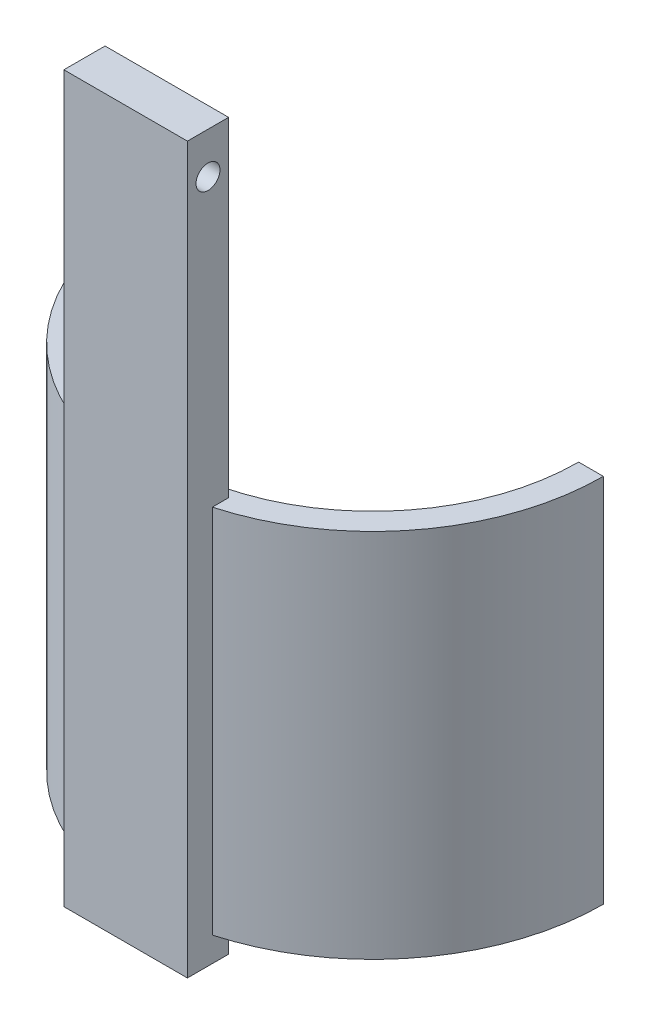
ISO-10303-21;
HEADER;
FILE_DESCRIPTION(('STEP AP214'),'2;1');
FILE_NAME('part.step','',(''),(''),'','','');
FILE_SCHEMA(('AUTOMOTIVE_DESIGN { 1 0 10303 214 1 1 1 1 }'));
ENDSEC;
DATA;
#1=APPLICATION_CONTEXT('core data for automotive mechanical design processes');
#2=APPLICATION_PROTOCOL_DEFINITION('international standard','automotive_design',2000,#1);
#3=PRODUCT_CONTEXT('',#1,'mechanical');
#4=PRODUCT('Part','Part','',(#3));
#5=PRODUCT_RELATED_PRODUCT_CATEGORY('part','',(#4));
#6=PRODUCT_DEFINITION_FORMATION('','',#4);
#7=PRODUCT_DEFINITION_CONTEXT('part definition',#1,'design');
#8=PRODUCT_DEFINITION('design','',#6,#7);
#9=PRODUCT_DEFINITION_SHAPE('','',#8);
#10=(LENGTH_UNIT() NAMED_UNIT(*) SI_UNIT(.MILLI.,.METRE.));
#11=(NAMED_UNIT(*) PLANE_ANGLE_UNIT() SI_UNIT($,.RADIAN.));
#12=(NAMED_UNIT(*) SI_UNIT($,.STERADIAN.) SOLID_ANGLE_UNIT());
#13=UNCERTAINTY_MEASURE_WITH_UNIT(LENGTH_MEASURE(1.E-05),#10,'distance_accuracy_value','');
#14=(GEOMETRIC_REPRESENTATION_CONTEXT(3) GLOBAL_UNCERTAINTY_ASSIGNED_CONTEXT((#13)) GLOBAL_UNIT_ASSIGNED_CONTEXT((#10,
#11,#12)) REPRESENTATION_CONTEXT('',''));
#15=CARTESIAN_POINT('',(0.,0.,0.));
#16=DIRECTION('',(0.,0.,1.));
#17=DIRECTION('',(1.,0.,0.));
#18=AXIS2_PLACEMENT_3D('',#15,#16,#17);
#19=CARTESIAN_POINT('',(50.4457593688363,45.,-1.74574066942157E-13));
#20=DIRECTION('',(0.,-1.,0.));
#21=DIRECTION('',(0.,0.,-1.));
#22=AXIS2_PLACEMENT_3D('',#19,#20,#21);
#23=PLANE('',#22);
#24=DIRECTION('',(0.,0.,-1.));
#25=VECTOR('',#24,1.);
#26=CARTESIAN_POINT('',(32.9457593688363,45.,-1.74574066942157E-13));
#27=LINE('',#26,#25);
#28=CARTESIAN_POINT('',(32.9457593688363,45.,26.9768419204324));
#29=VERTEX_POINT('',#28);
#30=CARTESIAN_POINT('',(32.9457593688363,45.,25.));
#31=VERTEX_POINT('',#30);
#32=EDGE_CURVE('E150',#29,#31,#27,.T.);
#33=ORIENTED_EDGE('',*,*,#32,.F.);
#34=CARTESIAN_POINT('',(25.4457593688363,45.,0.));
#35=DIRECTION('',(0.,-1.,0.));
#36=DIRECTION('',(0.,0.,-1.));
#37=AXIS2_PLACEMENT_3D('',#34,#35,#36);
#38=CIRCLE('',#37,28.);
#39=CARTESIAN_POINT('',(53.4457593688363,45.,-1.95522954975215E-13));
#40=VERTEX_POINT('',#39);
#41=EDGE_CURVE('E234',#40,#29,#38,.T.);
#42=ORIENTED_EDGE('',*,*,#41,.F.);
#43=DIRECTION('',(1.,0.,0.));
#44=VECTOR('',#43,1.);
#45=CARTESIAN_POINT('',(50.4457593688363,45.,-1.74574066942157E-13));
#46=LINE('',#45,#44);
#47=CARTESIAN_POINT('',(50.4457593688363,45.,-1.74574066942157E-13));
#48=VERTEX_POINT('',#47);
#49=EDGE_CURVE('E259',#48,#40,#46,.T.);
#50=ORIENTED_EDGE('',*,*,#49,.F.);
#51=CARTESIAN_POINT('',(25.4457593688363,45.,0.));
#52=DIRECTION('',(0.,-1.,0.));
#53=DIRECTION('',(0.,0.,-1.));
#54=AXIS2_PLACEMENT_3D('',#51,#52,#53);
#55=CIRCLE('',#54,25.);
#56=CARTESIAN_POINT('',(25.4457593688363,45.,25.));
#57=VERTEX_POINT('',#56);
#58=EDGE_CURVE('E230',#48,#57,#55,.T.);
#59=ORIENTED_EDGE('',*,*,#58,.T.);
#60=DIRECTION('',(1.,0.,0.));
#61=VECTOR('',#60,1.);
#62=CARTESIAN_POINT('',(50.4457593688363,45.,25.));
#63=LINE('',#62,#61);
#64=EDGE_CURVE('E200',#57,#31,#63,.T.);
#65=ORIENTED_EDGE('',*,*,#64,.T.);
#66=EDGE_LOOP('',(#33,#42,#50,#59,#65));
#67=FACE_BOUND('',#66,.T.);
#68=ADVANCED_FACE('F37',(#67),#23,.F.);
#69=CARTESIAN_POINT('',(25.4457593688363,0.,0.));
#70=DIRECTION('',(0.,-1.,0.));
#71=DIRECTION('',(0.,0.,-1.));
#72=AXIS2_PLACEMENT_3D('',#69,#70,#71);
#73=CYLINDRICAL_SURFACE('',#72,28.);
#74=DIRECTION('',(0.,-1.,0.));
#75=VECTOR('',#74,1.);
#76=CARTESIAN_POINT('',(32.9457593688363,0.,26.9768419204324));
#77=LINE('',#76,#75);
#78=CARTESIAN_POINT('',(32.9457593688363,0.,26.9768419204324));
#79=VERTEX_POINT('',#78);
#80=EDGE_CURVE('E283',#79,#29,#77,.F.);
#81=ORIENTED_EDGE('',*,*,#80,.F.);
#82=CARTESIAN_POINT('',(25.4457593688363,0.,0.));
#83=DIRECTION('',(0.,-1.,0.));
#84=DIRECTION('',(0.,0.,-1.));
#85=AXIS2_PLACEMENT_3D('',#82,#83,#84);
#86=CIRCLE('',#85,28.);
#87=CARTESIAN_POINT('',(53.4457593688363,0.,-1.95522954975215E-13));
#88=VERTEX_POINT('',#87);
#89=EDGE_CURVE('E238',#88,#79,#86,.T.);
#90=ORIENTED_EDGE('',*,*,#89,.F.);
#91=DIRECTION('',(0.,-1.,0.));
#92=VECTOR('',#91,1.);
#93=CARTESIAN_POINT('',(53.4457593688363,45.,-1.95522954975215E-13));
#94=LINE('',#93,#92);
#95=EDGE_CURVE('E256',#40,#88,#94,.T.);
#96=ORIENTED_EDGE('',*,*,#95,.F.);
#97=ORIENTED_EDGE('',*,*,#41,.T.);
#98=EDGE_LOOP('',(#81,#90,#96,#97));
#99=FACE_BOUND('',#98,.T.);
#100=ADVANCED_FACE('F325',(#99),#73,.T.);
#101=CARTESIAN_POINT('',(25.4457593688363,0.,0.));
#102=DIRECTION('',(0.,1.,0.));
#103=DIRECTION('',(0.,0.,1.));
#104=AXIS2_PLACEMENT_3D('',#101,#102,#103);
#105=CONICAL_SURFACE('',#104,28.,1.00247207792389);
#106=CARTESIAN_POINT('',(32.9457593688363,-3.71277565228321,20.8800019110646));
#107=CARTESIAN_POINT('',(32.9457593688363,-3.4297252035166,21.3509400558726));
#108=CARTESIAN_POINT('',(32.9457593688363,-3.14588900353543,21.8214048179285));
#109=CARTESIAN_POINT('',(32.9457593688363,-2.57687318146193,22.7615198068421));
#110=CARTESIAN_POINT('',(32.9457593688363,-2.29169356263384,23.2311700356753));
#111=CARTESIAN_POINT('',(32.9457593688363,-1.43448730284586,24.6390880883384));
#112=CARTESIAN_POINT('',(32.9457593688363,-0.860785643670425,25.5763359205008));
#113=CARTESIAN_POINT('',(32.9457593688363,0.289854374885558,27.448831207632));
#114=CARTESIAN_POINT('',(32.9457593688363,0.866792710967027,28.3840786769335));
#115=CARTESIAN_POINT('',(32.9457593688363,1.73403338757938,29.7858239147129));
#116=CARTESIAN_POINT('',(32.9457593688363,2.02342115261045,30.2528878974192));
#117=CARTESIAN_POINT('',(32.9457593688363,2.60273401745179,31.1866821787539));
#118=CARTESIAN_POINT('',(32.9457593688363,2.8926591169726,31.6534124775618));
#119=CARTESIAN_POINT('',(32.9457593688363,3.18281683727623,32.1199980889354));
#120=B_SPLINE_CURVE_WITH_KNOTS('',3,(#106,#107,#108,#109,#110,#111,#112,#113,#114,#115,#116,
#117,#118,#119),.UNSPECIFIED.,.F.,.F.,(4,2,2,2,2,2,4),(0.,1.6483614168177,3.29671883051607,
6.5933893831521,9.89003623521804,11.5383824954047,13.1867278678621),.UNSPECIFIED.);
#121=CARTESIAN_POINT('',(32.9457593688363,-1.21286370307695,25.));
#122=VERTEX_POINT('',#121);
#123=EDGE_CURVE('E11',#122,#79,#120,.T.);
#124=ORIENTED_EDGE('',*,*,#123,.F.);
#125=CARTESIAN_POINT('',(48.2094038127878,3.71094250380733,25.));
#126=CARTESIAN_POINT('',(47.85398089137,3.55813192087921,25.));
#127=CARTESIAN_POINT('',(47.4978504890139,3.40696676231018,25.));
#128=CARTESIAN_POINT('',(46.7840853915892,3.10821383256273,25.));
#129=CARTESIAN_POINT('',(46.4264506697837,2.96062612528557,25.));
#130=CARTESIAN_POINT('',(45.3509847210874,2.52358974517689,25.));
#131=CARTESIAN_POINT('',(44.6307804023094,2.23994928587109,25.));
#132=CARTESIAN_POINT('',(43.1801566705185,1.6896455468365,25.));
#133=CARTESIAN_POINT('',(42.4497058632801,1.42306446277605,25.));
#134=CARTESIAN_POINT('',(40.9813636502367,0.911596762611606,25.));
#135=CARTESIAN_POINT('',(40.2434727812245,0.666708593685356,25.));
#136=CARTESIAN_POINT('',(38.0336347731473,-0.0249102235611489,25.));
#137=CARTESIAN_POINT('',(36.5495809139223,-0.434803580546638,25.));
#138=CARTESIAN_POINT('',(34.301898440624,-0.949555753891683,25.));
#139=CARTESIAN_POINT('',(33.5495845715975,-1.10438784087447,25.));
#140=CARTESIAN_POINT('',(32.038142453276,-1.3765672904669,25.));
#141=CARTESIAN_POINT('',(31.2790146573787,-1.49391712840765,25.));
#142=CARTESIAN_POINT('',(29.8454841873718,-1.67592201179391,25.));
#143=CARTESIAN_POINT('',(29.1716640420606,-1.7451637069647,25.));
#144=CARTESIAN_POINT('',(27.8213769687644,-1.84961183063666,25.));
#145=CARTESIAN_POINT('',(27.1449101129099,-1.88481918027421,25.));
#146=CARTESIAN_POINT('',(25.7909650849722,-1.92014328254269,25.));
#147=CARTESIAN_POINT('',(25.1134867911669,-1.92025540196876,25.));
#148=CARTESIAN_POINT('',(23.759437702169,-1.88537494319395,25.));
#149=CARTESIAN_POINT('',(23.0828669134722,-1.85038211504539,25.));
#150=CARTESIAN_POINT('',(21.731603452682,-1.74628288053355,25.));
#151=CARTESIAN_POINT('',(21.0569137960488,-1.67713767857691,25.));
#152=CARTESIAN_POINT('',(19.711635625573,-1.50666629663663,25.));
#153=CARTESIAN_POINT('',(19.0410471836462,-1.40533955398256,25.));
#154=CARTESIAN_POINT('',(17.7049459350727,-1.17306954311445,25.));
#155=CARTESIAN_POINT('',(17.0394339508276,-1.0421215772586,25.));
#156=CARTESIAN_POINT('',(15.7142016261914,-0.753524103314675,25.));
#157=CARTESIAN_POINT('',(15.0544818986984,-0.595871804529322,25.));
#158=CARTESIAN_POINT('',(13.3922712924114,-0.166812440750636,25.));
#159=CARTESIAN_POINT('',(12.3938910275654,0.120530572574965,25.));
#160=CARTESIAN_POINT('',(10.4116342574636,0.740478097902538,25.));
#161=CARTESIAN_POINT('',(9.42775557850021,1.07307574841732,25.));
#162=CARTESIAN_POINT('',(7.96362795721506,1.59874897872435,25.));
#163=CARTESIAN_POINT('',(7.47838366936861,1.7780947086061,25.));
#164=CARTESIAN_POINT('',(6.51097999946445,2.14495257618082,25.));
#165=CARTESIAN_POINT('',(6.028820656434,2.33246481695396,25.));
#166=CARTESIAN_POINT('',(5.06765036376748,2.71470715841417,25.));
#167=CARTESIAN_POINT('',(4.58863800243263,2.9094337194544,25.));
#168=CARTESIAN_POINT('',(3.63336665245971,3.3054475576342,25.));
#169=CARTESIAN_POINT('',(3.15710749141185,3.50673441860077,25.));
#170=CARTESIAN_POINT('',(2.68211492488474,3.71094250380733,25.));
#171=B_SPLINE_CURVE_WITH_KNOTS('',3,(#125,#126,#127,#128,#129,#130,#131,#132,#133,#134,#135,
#136,#137,#138,#139,#140,#141,#142,#143,#144,#145,#146,#147,#148,#149,#150,#151,#152,#153,#154,
#155,#156,#157,#158,#159,#160,#161,#162,#163,#164,#165,#166,#167,#168,#169,#170),.UNSPECIFIED.,
.F.,.F.,(4,2,2,2,2,2,2,2,2,2,2,2,2,2,2,2,2,2,2,2,2,2,4),(0.,1.16063578353103,2.32129228334784,
4.64322174447446,6.97560638421448,9.30782393205399,13.9210143672565,16.2245090737235,
18.5278516257244,20.5591560958256,22.5904055873217,24.6219232403604,26.653455357934,
28.6873005325069,30.7211812693159,32.7553847865173,34.7898010164836,37.905099446034,
41.0199260607241,42.5718471810838,44.1237878959442,45.6749769939695,47.2260678783044),.UNSPECIFIED.);
#172=CARTESIAN_POINT('',(17.9457593688363,-1.21286370307695,25.));
#173=VERTEX_POINT('',#172);
#174=EDGE_CURVE('E187',#122,#173,#171,.T.);
#175=ORIENTED_EDGE('',*,*,#174,.T.);
#176=CARTESIAN_POINT('',(17.9457593688363,-3.71277565228321,20.8800019110646));
#177=CARTESIAN_POINT('',(17.9457593688363,-3.4297252035166,21.3509400558726));
#178=CARTESIAN_POINT('',(17.9457593688363,-3.14588900353543,21.8214048179285));
#179=CARTESIAN_POINT('',(17.9457593688363,-2.57687318146193,22.7615198068421));
#180=CARTESIAN_POINT('',(17.9457593688363,-2.29169356263384,23.2311700356753));
#181=CARTESIAN_POINT('',(17.9457593688363,-1.43448730284586,24.6390880883384));
#182=CARTESIAN_POINT('',(17.9457593688363,-0.860785643670426,25.5763359205008));
#183=CARTESIAN_POINT('',(17.9457593688363,0.289854374885557,27.448831207632));
#184=CARTESIAN_POINT('',(17.9457593688363,0.866792710967026,28.3840786769335));
#185=CARTESIAN_POINT('',(17.9457593688363,1.73403338757938,29.7858239147129));
#186=CARTESIAN_POINT('',(17.9457593688363,2.02342115261044,30.2528878974192));
#187=CARTESIAN_POINT('',(17.9457593688363,2.60273401745178,31.1866821787539));
#188=CARTESIAN_POINT('',(17.9457593688363,2.89265911697259,31.6534124775618));
#189=CARTESIAN_POINT('',(17.9457593688363,3.18281683727623,32.1199980889354));
#190=B_SPLINE_CURVE_WITH_KNOTS('',3,(#176,#177,#178,#179,#180,#181,#182,#183,#184,#185,#186,
#187,#188,#189),.UNSPECIFIED.,.F.,.F.,(4,2,2,2,2,2,4),(0.,1.6483614168177,3.29671883051607,
6.5933893831521,9.89003623521804,11.5383824954047,13.1867278678621),.UNSPECIFIED.);
#191=CARTESIAN_POINT('',(17.9457593688363,0.,26.9768419204324));
#192=VERTEX_POINT('',#191);
#193=EDGE_CURVE('E46',#173,#192,#190,.T.);
#194=ORIENTED_EDGE('',*,*,#193,.T.);
#195=CARTESIAN_POINT('',(-2.55424063116371,0.,0.));
#196=VERTEX_POINT('',#195);
#197=EDGE_CURVE('E241',#192,#196,#86,.T.);
#198=ORIENTED_EDGE('',*,*,#197,.T.);
#199=DIRECTION('',(0.842804081665545,-0.538220475203143,0.));
#200=VECTOR('',#199,1.);
#201=CARTESIAN_POINT('',(-2.55424063116371,0.,0.));
#202=LINE('',#201,#200);
#203=CARTESIAN_POINT('',(1.86726430970888,-2.82360342356987,0.));
#204=VERTEX_POINT('',#203);
#205=EDGE_CURVE('E270',#196,#204,#202,.T.);
#206=ORIENTED_EDGE('',*,*,#205,.T.);
#207=CARTESIAN_POINT('',(25.4457593688363,-2.82360342356987,0.));
#208=DIRECTION('',(0.,-1.,0.));
#209=DIRECTION('',(0.,0.,-1.));
#210=AXIS2_PLACEMENT_3D('',#207,#208,#209);
#211=CIRCLE('',#210,23.5784950591274);
#212=CARTESIAN_POINT('',(49.0242544279637,-2.82360342356987,-1.64647750993897E-13));
#213=VERTEX_POINT('',#212);
#214=EDGE_CURVE('E242',#213,#204,#211,.T.);
#215=ORIENTED_EDGE('',*,*,#214,.F.);
#216=DIRECTION('',(-0.842804081665545,-0.538220475203143,0.));
#217=VECTOR('',#216,1.);
#218=CARTESIAN_POINT('',(53.4457593688363,0.,-1.95522954975215E-13));
#219=LINE('',#218,#217);
#220=EDGE_CURVE('E253',#88,#213,#219,.T.);
#221=ORIENTED_EDGE('',*,*,#220,.F.);
#222=ORIENTED_EDGE('',*,*,#89,.T.);
#223=EDGE_LOOP('',(#124,#175,#194,#198,#206,#215,#221,#222));
#224=FACE_BOUND('',#223,.T.);
#225=ADVANCED_FACE('F202',(#224),#105,.T.);
#226=CARTESIAN_POINT('',(25.4457593688363,0.,0.));
#227=DIRECTION('',(0.,-1.,0.));
#228=DIRECTION('',(0.,0.,-1.));
#229=AXIS2_PLACEMENT_3D('',#226,#227,#228);
#230=CYLINDRICAL_SURFACE('',#229,25.);
#231=CARTESIAN_POINT('',(25.4457593688363,0.,0.));
#232=DIRECTION('',(0.,-1.,0.));
#233=DIRECTION('',(0.,0.,-1.));
#234=AXIS2_PLACEMENT_3D('',#231,#232,#233);
#235=CIRCLE('',#234,25.);
#236=CARTESIAN_POINT('',(50.4457593688363,0.,-1.74574066942157E-13));
#237=VERTEX_POINT('',#236);
#238=CARTESIAN_POINT('',(0.445759368836285,0.,0.));
#239=VERTEX_POINT('',#238);
#240=EDGE_CURVE('E61',#237,#239,#235,.T.);
#241=ORIENTED_EDGE('',*,*,#240,.T.);
#242=DIRECTION('',(0.,1.,0.));
#243=VECTOR('',#242,1.);
#244=CARTESIAN_POINT('',(0.445759368836285,0.,0.));
#245=LINE('',#244,#243);
#246=CARTESIAN_POINT('',(0.445759368836285,45.,0.));
#247=VERTEX_POINT('',#246);
#248=EDGE_CURVE('E279',#239,#247,#245,.T.);
#249=ORIENTED_EDGE('',*,*,#248,.T.);
#250=EDGE_CURVE('E233',#57,#247,#55,.T.);
#251=ORIENTED_EDGE('',*,*,#250,.F.);
#252=ORIENTED_EDGE('',*,*,#58,.F.);
#253=DIRECTION('',(0.,1.,0.));
#254=VECTOR('',#253,1.);
#255=CARTESIAN_POINT('',(50.4457593688363,0.,-1.74574066942157E-13));
#256=LINE('',#255,#254);
#257=EDGE_CURVE('E262',#237,#48,#256,.T.);
#258=ORIENTED_EDGE('',*,*,#257,.F.);
#259=EDGE_LOOP('',(#241,#249,#251,#252,#258));
#260=FACE_BOUND('',#259,.T.);
#261=ADVANCED_FACE('F331',(#260),#230,.F.);
#262=CARTESIAN_POINT('',(17.9457593688363,45.,26.9768419204324));
#263=VERTEX_POINT('',#262);
#264=CARTESIAN_POINT('',(-2.55424063116371,45.,0.));
#265=VERTEX_POINT('',#264);
#266=EDGE_CURVE('E237',#263,#265,#38,.T.);
#267=ORIENTED_EDGE('',*,*,#266,.F.);
#268=DIRECTION('',(0.,0.,-1.));
#269=VECTOR('',#268,1.);
#270=CARTESIAN_POINT('',(17.9457593688363,45.,-1.74574066942157E-13));
#271=LINE('',#270,#269);
#272=CARTESIAN_POINT('',(17.9457593688363,45.,25.));
#273=VERTEX_POINT('',#272);
#274=EDGE_CURVE('E285',#263,#273,#271,.T.);
#275=ORIENTED_EDGE('',*,*,#274,.T.);
#276=EDGE_CURVE('E289',#273,#57,#63,.T.);
#277=ORIENTED_EDGE('',*,*,#276,.T.);
#278=ORIENTED_EDGE('',*,*,#250,.T.);
#279=DIRECTION('',(-1.,0.,0.));
#280=VECTOR('',#279,1.);
#281=CARTESIAN_POINT('',(0.445759368836285,45.,0.));
#282=LINE('',#281,#280);
#283=EDGE_CURVE('E276',#247,#265,#282,.T.);
#284=ORIENTED_EDGE('',*,*,#283,.T.);
#285=EDGE_LOOP('',(#267,#275,#277,#278,#284));
#286=FACE_BOUND('',#285,.T.);
#287=ADVANCED_FACE('F39',(#286),#23,.F.);
#288=ORIENTED_EDGE('',*,*,#197,.F.);
#289=DIRECTION('',(0.,-1.,0.));
#290=VECTOR('',#289,1.);
#291=CARTESIAN_POINT('',(17.9457593688363,0.,26.9768419204324));
#292=LINE('',#291,#290);
#293=EDGE_CURVE('E287',#192,#263,#292,.F.);
#294=ORIENTED_EDGE('',*,*,#293,.T.);
#295=ORIENTED_EDGE('',*,*,#266,.T.);
#296=DIRECTION('',(0.,-1.,0.));
#297=VECTOR('',#296,1.);
#298=CARTESIAN_POINT('',(-2.55424063116371,45.,0.));
#299=LINE('',#298,#297);
#300=EDGE_CURVE('E273',#265,#196,#299,.T.);
#301=ORIENTED_EDGE('',*,*,#300,.T.);
#302=EDGE_LOOP('',(#288,#294,#295,#301));
#303=FACE_BOUND('',#302,.T.);
#304=ADVANCED_FACE('F301',(#303),#73,.T.);
#305=CARTESIAN_POINT('',(49.0242544279637,-2.82360342356987,-1.64647750993897E-13));
#306=DIRECTION('',(0.,1.,0.));
#307=DIRECTION('',(0.,0.,1.));
#308=AXIS2_PLACEMENT_3D('',#305,#306,#307);
#309=PLANE('',#308);
#310=CARTESIAN_POINT('',(25.4457593688363,-2.82360342356987,0.));
#311=DIRECTION('',(0.,-1.,0.));
#312=DIRECTION('',(0.,0.,-1.));
#313=AXIS2_PLACEMENT_3D('',#310,#311,#312);
#314=CIRCLE('',#313,20.5784950591274);
#315=CARTESIAN_POINT('',(46.0242544279637,-2.82360342356987,-1.43698862960838E-13));
#316=VERTEX_POINT('',#315);
#317=CARTESIAN_POINT('',(4.86726430970888,-2.82360342356987,0.));
#318=VERTEX_POINT('',#317);
#319=EDGE_CURVE('E244',#316,#318,#314,.T.);
#320=ORIENTED_EDGE('',*,*,#319,.F.);
#321=DIRECTION('',(-1.,0.,0.));
#322=VECTOR('',#321,1.);
#323=CARTESIAN_POINT('',(49.0242544279637,-2.82360342356987,-1.64647750993897E-13));
#324=LINE('',#323,#322);
#325=EDGE_CURVE('E250',#213,#316,#324,.T.);
#326=ORIENTED_EDGE('',*,*,#325,.F.);
#327=ORIENTED_EDGE('',*,*,#214,.T.);
#328=DIRECTION('',(1.,0.,0.));
#329=VECTOR('',#328,1.);
#330=CARTESIAN_POINT('',(1.86726430970888,-2.82360342356987,0.));
#331=LINE('',#330,#329);
#332=EDGE_CURVE('E267',#204,#318,#331,.T.);
#333=ORIENTED_EDGE('',*,*,#332,.T.);
#334=EDGE_LOOP('',(#320,#326,#327,#333));
#335=FACE_BOUND('',#334,.T.);
#336=ADVANCED_FACE('F336',(#335),#309,.F.);
#337=CARTESIAN_POINT('',(25.4457593688363,-2.82360342356987,0.));
#338=DIRECTION('',(0.,1.,0.));
#339=DIRECTION('',(0.,0.,1.));
#340=AXIS2_PLACEMENT_3D('',#337,#338,#339);
#341=CONICAL_SURFACE('',#340,20.5784950591274,1.00247207792389);
#342=DIRECTION('',(0.842804081665545,0.538220475203143,0.));
#343=VECTOR('',#342,1.);
#344=CARTESIAN_POINT('',(50.4457593688363,0.,-1.74574066942157E-13));
#345=LINE('',#344,#343);
#346=EDGE_CURVE('E247',#316,#237,#345,.T.);
#347=ORIENTED_EDGE('',*,*,#346,.F.);
#348=ORIENTED_EDGE('',*,*,#319,.T.);
#349=DIRECTION('',(-0.842804081665545,0.538220475203143,0.));
#350=VECTOR('',#349,1.);
#351=CARTESIAN_POINT('',(0.445759368836285,0.,0.));
#352=LINE('',#351,#350);
#353=EDGE_CURVE('E265',#318,#239,#352,.T.);
#354=ORIENTED_EDGE('',*,*,#353,.T.);
#355=ORIENTED_EDGE('',*,*,#240,.F.);
#356=EDGE_LOOP('',(#347,#348,#354,#355));
#357=FACE_BOUND('',#356,.T.);
#358=ADVANCED_FACE('F344',(#357),#341,.F.);
#359=CARTESIAN_POINT('',(50.8915187376726,0.,-1.77686787977969E-13));
#360=DIRECTION('',(0.,0.,-1.));
#361=DIRECTION('',(-1.,0.,0.));
#362=AXIS2_PLACEMENT_3D('',#359,#360,#361);
#363=PLANE('',#362);
#364=ORIENTED_EDGE('',*,*,#257,.T.);
#365=ORIENTED_EDGE('',*,*,#49,.T.);
#366=ORIENTED_EDGE('',*,*,#95,.T.);
#367=ORIENTED_EDGE('',*,*,#220,.T.);
#368=ORIENTED_EDGE('',*,*,#325,.T.);
#369=ORIENTED_EDGE('',*,*,#346,.T.);
#370=EDGE_LOOP('',(#364,#365,#366,#367,#368,#369));
#371=FACE_BOUND('',#370,.T.);
#372=ADVANCED_FACE('F343',(#371),#363,.T.);
#373=CARTESIAN_POINT('',(0.,0.,0.));
#374=DIRECTION('',(0.,0.,1.));
#375=DIRECTION('',(1.,0.,0.));
#376=AXIS2_PLACEMENT_3D('',#373,#374,#375);
#377=PLANE('',#376);
#378=ORIENTED_EDGE('',*,*,#248,.F.);
#379=ORIENTED_EDGE('',*,*,#353,.F.);
#380=ORIENTED_EDGE('',*,*,#332,.F.);
#381=ORIENTED_EDGE('',*,*,#205,.F.);
#382=ORIENTED_EDGE('',*,*,#300,.F.);
#383=ORIENTED_EDGE('',*,*,#283,.F.);
#384=EDGE_LOOP('',(#378,#379,#380,#381,#382,#383));
#385=FACE_BOUND('',#384,.T.);
#386=ADVANCED_FACE('F216',(#385),#377,.F.);
#387=CARTESIAN_POINT('',(32.9457593688363,-3.00000000000002,0.));
#388=DIRECTION('',(-1.,0.,0.));
#389=DIRECTION('',(0.,0.,1.));
#390=AXIS2_PLACEMENT_3D('',#387,#388,#389);
#391=PLANE('',#390);
#392=CARTESIAN_POINT('',(32.9457593688363,80.,27.5));
#393=DIRECTION('',(1.,0.,0.));
#394=DIRECTION('',(0.,0.,-1.));
#395=AXIS2_PLACEMENT_3D('',#392,#393,#394);
#396=CIRCLE('',#395,1.45);
#397=CARTESIAN_POINT('',(32.9457593688363,80.,26.05));
#398=VERTEX_POINT('',#397);
#399=EDGE_CURVE('E171',#398,#398,#396,.T.);
#400=ORIENTED_EDGE('',*,*,#399,.F.);
#401=EDGE_LOOP('',(#400));
#402=FACE_BOUND('',#401,.T.);
#403=ORIENTED_EDGE('',*,*,#80,.T.);
#404=ORIENTED_EDGE('',*,*,#32,.T.);
#405=DIRECTION('',(0.,1.,0.));
#406=VECTOR('',#405,1.);
#407=CARTESIAN_POINT('',(32.9457593688363,-3.00000000000002,25.));
#408=LINE('',#407,#406);
#409=CARTESIAN_POINT('',(32.9457593688363,85.,25.));
#410=VERTEX_POINT('',#409);
#411=EDGE_CURVE('E142',#31,#410,#408,.T.);
#412=ORIENTED_EDGE('',*,*,#411,.T.);
#413=DIRECTION('',(0.,0.,1.));
#414=VECTOR('',#413,1.);
#415=CARTESIAN_POINT('',(32.9457593688363,85.,0.));
#416=LINE('',#415,#414);
#417=CARTESIAN_POINT('',(32.9457593688363,85.,30.));
#418=VERTEX_POINT('',#417);
#419=EDGE_CURVE('E147',#410,#418,#416,.T.);
#420=ORIENTED_EDGE('',*,*,#419,.T.);
#421=DIRECTION('',(0.,1.,0.));
#422=VECTOR('',#421,1.);
#423=CARTESIAN_POINT('',(32.9457593688363,-3.00000000000002,30.));
#424=LINE('',#423,#422);
#425=CARTESIAN_POINT('',(32.9457593688363,-3.00000000000002,30.));
#426=VERTEX_POINT('',#425);
#427=EDGE_CURVE('E185',#426,#418,#424,.T.);
#428=ORIENTED_EDGE('',*,*,#427,.F.);
#429=DIRECTION('',(0.,0.,1.));
#430=VECTOR('',#429,1.);
#431=CARTESIAN_POINT('',(32.9457593688363,-3.00000000000002,0.));
#432=LINE('',#431,#430);
#433=CARTESIAN_POINT('',(32.9457593688363,-3.00000000000002,25.));
#434=VERTEX_POINT('',#433);
#435=EDGE_CURVE('E176',#434,#426,#432,.T.);
#436=ORIENTED_EDGE('',*,*,#435,.F.);
#437=EDGE_CURVE('E153',#434,#122,#408,.T.);
#438=ORIENTED_EDGE('',*,*,#437,.T.);
#439=ORIENTED_EDGE('',*,*,#123,.T.);
#440=EDGE_LOOP('',(#403,#404,#412,#420,#428,#436,#438,#439));
#441=FACE_BOUND('',#440,.T.);
#442=ADVANCED_FACE('F144',(#402,#441),#391,.F.);
#443=CARTESIAN_POINT('',(17.9457593688363,-3.00000000000002,0.));
#444=DIRECTION('',(-1.,0.,0.));
#445=DIRECTION('',(0.,0.,1.));
#446=AXIS2_PLACEMENT_3D('',#443,#444,#445);
#447=PLANE('',#446);
#448=CARTESIAN_POINT('',(17.9457593688363,80.,27.5));
#449=DIRECTION('',(-1.,0.,0.));
#450=DIRECTION('',(0.,0.,1.));
#451=AXIS2_PLACEMENT_3D('',#448,#449,#450);
#452=CIRCLE('',#451,1.45);
#453=CARTESIAN_POINT('',(17.9457593688363,80.,28.95));
#454=VERTEX_POINT('',#453);
#455=EDGE_CURVE('E41',#454,#454,#452,.T.);
#456=ORIENTED_EDGE('',*,*,#455,.F.);
#457=EDGE_LOOP('',(#456));
#458=FACE_BOUND('',#457,.T.);
#459=ORIENTED_EDGE('',*,*,#274,.F.);
#460=ORIENTED_EDGE('',*,*,#293,.F.);
#461=ORIENTED_EDGE('',*,*,#193,.F.);
#462=DIRECTION('',(0.,1.,0.));
#463=VECTOR('',#462,1.);
#464=CARTESIAN_POINT('',(17.9457593688363,-3.00000000000002,25.));
#465=LINE('',#464,#463);
#466=CARTESIAN_POINT('',(17.9457593688363,-3.00000000000002,25.));
#467=VERTEX_POINT('',#466);
#468=EDGE_CURVE('E53',#467,#173,#465,.T.);
#469=ORIENTED_EDGE('',*,*,#468,.F.);
#470=DIRECTION('',(0.,0.,1.));
#471=VECTOR('',#470,1.);
#472=CARTESIAN_POINT('',(17.9457593688363,-3.00000000000002,0.));
#473=LINE('',#472,#471);
#474=CARTESIAN_POINT('',(17.9457593688363,-3.00000000000002,30.));
#475=VERTEX_POINT('',#474);
#476=EDGE_CURVE('E181',#467,#475,#473,.T.);
#477=ORIENTED_EDGE('',*,*,#476,.T.);
#478=DIRECTION('',(0.,1.,0.));
#479=VECTOR('',#478,1.);
#480=CARTESIAN_POINT('',(17.9457593688363,-3.00000000000002,30.));
#481=LINE('',#480,#479);
#482=CARTESIAN_POINT('',(17.9457593688363,85.,30.));
#483=VERTEX_POINT('',#482);
#484=EDGE_CURVE('E188',#475,#483,#481,.T.);
#485=ORIENTED_EDGE('',*,*,#484,.T.);
#486=DIRECTION('',(0.,0.,1.));
#487=VECTOR('',#486,1.);
#488=CARTESIAN_POINT('',(17.9457593688363,85.,0.));
#489=LINE('',#488,#487);
#490=CARTESIAN_POINT('',(17.9457593688363,85.,25.));
#491=VERTEX_POINT('',#490);
#492=EDGE_CURVE('E164',#491,#483,#489,.T.);
#493=ORIENTED_EDGE('',*,*,#492,.F.);
#494=EDGE_CURVE('E160',#273,#491,#465,.T.);
#495=ORIENTED_EDGE('',*,*,#494,.F.);
#496=EDGE_LOOP('',(#459,#460,#461,#469,#477,#485,#493,#495));
#497=FACE_BOUND('',#496,.T.);
#498=ADVANCED_FACE('F210',(#458,#497),#447,.T.);
#499=CARTESIAN_POINT('',(0.,-3.00000000000002,25.));
#500=DIRECTION('',(0.,0.,-1.));
#501=DIRECTION('',(-1.,0.,0.));
#502=AXIS2_PLACEMENT_3D('',#499,#500,#501);
#503=PLANE('',#502);
#504=ORIENTED_EDGE('',*,*,#276,.F.);
#505=ORIENTED_EDGE('',*,*,#494,.T.);
#506=DIRECTION('',(-1.,0.,0.));
#507=VECTOR('',#506,1.);
#508=CARTESIAN_POINT('',(0.,85.,25.));
#509=LINE('',#508,#507);
#510=EDGE_CURVE('E157',#410,#491,#509,.T.);
#511=ORIENTED_EDGE('',*,*,#510,.F.);
#512=ORIENTED_EDGE('',*,*,#411,.F.);
#513=ORIENTED_EDGE('',*,*,#64,.F.);
#514=EDGE_LOOP('',(#504,#505,#511,#512,#513));
#515=FACE_BOUND('',#514,.T.);
#516=ADVANCED_FACE('F158',(#515),#503,.T.);
#517=ORIENTED_EDGE('',*,*,#174,.F.);
#518=ORIENTED_EDGE('',*,*,#437,.F.);
#519=DIRECTION('',(-1.,0.,0.));
#520=VECTOR('',#519,1.);
#521=CARTESIAN_POINT('',(0.,-3.00000000000002,25.));
#522=LINE('',#521,#520);
#523=EDGE_CURVE('E179',#434,#467,#522,.T.);
#524=ORIENTED_EDGE('',*,*,#523,.T.);
#525=ORIENTED_EDGE('',*,*,#468,.T.);
#526=EDGE_LOOP('',(#517,#518,#524,#525));
#527=FACE_BOUND('',#526,.T.);
#528=ADVANCED_FACE('F209',(#527),#503,.T.);
#529=CARTESIAN_POINT('',(0.,-3.00000000000002,30.));
#530=DIRECTION('',(0.,0.,-1.));
#531=DIRECTION('',(-1.,0.,0.));
#532=AXIS2_PLACEMENT_3D('',#529,#530,#531);
#533=PLANE('',#532);
#534=ORIENTED_EDGE('',*,*,#427,.T.);
#535=DIRECTION('',(-1.,0.,0.));
#536=VECTOR('',#535,1.);
#537=CARTESIAN_POINT('',(0.,85.,30.));
#538=LINE('',#537,#536);
#539=EDGE_CURVE('E168',#418,#483,#538,.T.);
#540=ORIENTED_EDGE('',*,*,#539,.T.);
#541=ORIENTED_EDGE('',*,*,#484,.F.);
#542=DIRECTION('',(-1.,0.,0.));
#543=VECTOR('',#542,1.);
#544=CARTESIAN_POINT('',(0.,-3.00000000000002,30.));
#545=LINE('',#544,#543);
#546=EDGE_CURVE('E154',#426,#475,#545,.T.);
#547=ORIENTED_EDGE('',*,*,#546,.F.);
#548=EDGE_LOOP('',(#534,#540,#541,#547));
#549=FACE_BOUND('',#548,.T.);
#550=ADVANCED_FACE('F317',(#549),#533,.F.);
#551=CARTESIAN_POINT('',(0.,-3.00000000000002,0.));
#552=DIRECTION('',(0.,1.,0.));
#553=DIRECTION('',(0.,0.,1.));
#554=AXIS2_PLACEMENT_3D('',#551,#552,#553);
#555=PLANE('',#554);
#556=ORIENTED_EDGE('',*,*,#435,.T.);
#557=ORIENTED_EDGE('',*,*,#546,.T.);
#558=ORIENTED_EDGE('',*,*,#476,.F.);
#559=ORIENTED_EDGE('',*,*,#523,.F.);
#560=EDGE_LOOP('',(#556,#557,#558,#559));
#561=FACE_BOUND('',#560,.T.);
#562=ADVANCED_FACE('F313',(#561),#555,.F.);
#563=CARTESIAN_POINT('',(0.,85.,0.));
#564=DIRECTION('',(0.,1.,0.));
#565=DIRECTION('',(0.,0.,1.));
#566=AXIS2_PLACEMENT_3D('',#563,#564,#565);
#567=PLANE('',#566);
#568=ORIENTED_EDGE('',*,*,#419,.F.);
#569=ORIENTED_EDGE('',*,*,#510,.T.);
#570=ORIENTED_EDGE('',*,*,#492,.T.);
#571=ORIENTED_EDGE('',*,*,#539,.F.);
#572=EDGE_LOOP('',(#568,#569,#570,#571));
#573=FACE_BOUND('',#572,.T.);
#574=ADVANCED_FACE('F166',(#573),#567,.T.);
#575=CARTESIAN_POINT('',(-7.05424063116372,80.,27.5));
#576=DIRECTION('',(1.,0.,0.));
#577=DIRECTION('',(0.,0.,-1.));
#578=AXIS2_PLACEMENT_3D('',#575,#576,#577);
#579=CYLINDRICAL_SURFACE('',#578,1.45);
#580=ORIENTED_EDGE('',*,*,#455,.T.);
#581=EDGE_LOOP('',(#580));
#582=FACE_BOUND('',#581,.T.);
#583=ORIENTED_EDGE('',*,*,#399,.T.);
#584=EDGE_LOOP('',(#583));
#585=FACE_BOUND('',#584,.T.);
#586=ADVANCED_FACE('F402',(#582,#585),#579,.F.);
#587=CLOSED_SHELL('',(#68,#100,#225,#261,#287,#304,#336,#358,#372,#386,#442,#498,#516,#528,#550,
#562,#574,#586));
#588=MANIFOLD_SOLID_BREP('B2',#587);
#589=ADVANCED_BREP_SHAPE_REPRESENTATION('',(#18,#588),#14);
#590=SHAPE_DEFINITION_REPRESENTATION(#9,#589);
ENDSEC;
END-ISO-10303-21;
